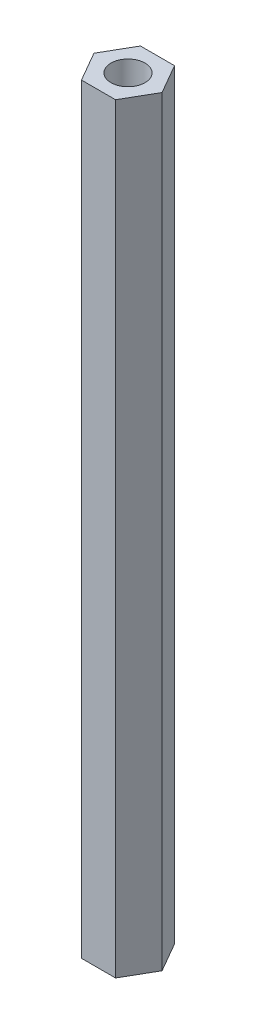
ISO-10303-21;
HEADER;
FILE_DESCRIPTION(('STEP AP214'),'2;1');
FILE_NAME('part.step','',(''),(''),'','','');
FILE_SCHEMA(('AUTOMOTIVE_DESIGN { 1 0 10303 214 1 1 1 1 }'));
ENDSEC;
DATA;
#1=APPLICATION_CONTEXT('core data for automotive mechanical design processes');
#2=APPLICATION_PROTOCOL_DEFINITION('international standard','automotive_design',2000,#1);
#3=PRODUCT_CONTEXT('',#1,'mechanical');
#4=PRODUCT('Part','Part','',(#3));
#5=PRODUCT_RELATED_PRODUCT_CATEGORY('part','',(#4));
#6=PRODUCT_DEFINITION_FORMATION('','',#4);
#7=PRODUCT_DEFINITION_CONTEXT('part definition',#1,'design');
#8=PRODUCT_DEFINITION('design','',#6,#7);
#9=PRODUCT_DEFINITION_SHAPE('','',#8);
#10=(LENGTH_UNIT() NAMED_UNIT(*) SI_UNIT(.MILLI.,.METRE.));
#11=(NAMED_UNIT(*) PLANE_ANGLE_UNIT() SI_UNIT($,.RADIAN.));
#12=(NAMED_UNIT(*) SI_UNIT($,.STERADIAN.) SOLID_ANGLE_UNIT());
#13=UNCERTAINTY_MEASURE_WITH_UNIT(LENGTH_MEASURE(1.E-05),#10,'distance_accuracy_value','');
#14=(GEOMETRIC_REPRESENTATION_CONTEXT(3) GLOBAL_UNCERTAINTY_ASSIGNED_CONTEXT((#13)) GLOBAL_UNIT_ASSIGNED_CONTEXT((#10,
#11,#12)) REPRESENTATION_CONTEXT('',''));
#15=CARTESIAN_POINT('',(0.,0.,0.));
#16=DIRECTION('',(0.,0.,1.));
#17=DIRECTION('',(1.,0.,0.));
#18=AXIS2_PLACEMENT_3D('',#15,#16,#17);
#19=CARTESIAN_POINT('',(0.,67.,0.));
#20=DIRECTION('',(0.,1.,0.));
#21=DIRECTION('',(0.,0.,1.));
#22=AXIS2_PLACEMENT_3D('',#19,#20,#21);
#23=PLANE('',#22);
#24=DIRECTION('',(0.499999999999999,0.,-0.866025403784439));
#25=VECTOR('',#24,1.);
#26=CARTESIAN_POINT('',(1.5,67.,2.59807621135332));
#27=LINE('',#26,#25);
#28=CARTESIAN_POINT('',(1.5,67.,2.59807621135332));
#29=VERTEX_POINT('',#28);
#30=CARTESIAN_POINT('',(3.,67.,0.));
#31=VERTEX_POINT('',#30);
#32=EDGE_CURVE('E150',#29,#31,#27,.T.);
#33=ORIENTED_EDGE('',*,*,#32,.T.);
#34=DIRECTION('',(-0.5,0.,-0.866025403784439));
#35=VECTOR('',#34,1.);
#36=CARTESIAN_POINT('',(3.,67.,0.));
#37=LINE('',#36,#35);
#38=CARTESIAN_POINT('',(1.5,67.,-2.59807621135332));
#39=VERTEX_POINT('',#38);
#40=EDGE_CURVE('E98',#31,#39,#37,.T.);
#41=ORIENTED_EDGE('',*,*,#40,.T.);
#42=DIRECTION('',(-1.,0.,0.));
#43=VECTOR('',#42,1.);
#44=CARTESIAN_POINT('',(1.5,67.,-2.59807621135332));
#45=LINE('',#44,#43);
#46=CARTESIAN_POINT('',(-1.5,67.,-2.59807621135332));
#47=VERTEX_POINT('',#46);
#48=EDGE_CURVE('E111',#39,#47,#45,.T.);
#49=ORIENTED_EDGE('',*,*,#48,.T.);
#50=DIRECTION('',(-0.499999999999999,0.,0.866025403784439));
#51=VECTOR('',#50,1.);
#52=CARTESIAN_POINT('',(-1.5,67.,-2.59807621135332));
#53=LINE('',#52,#51);
#54=CARTESIAN_POINT('',(-3.,67.,0.));
#55=VERTEX_POINT('',#54);
#56=EDGE_CURVE('E105',#47,#55,#53,.T.);
#57=ORIENTED_EDGE('',*,*,#56,.T.);
#58=DIRECTION('',(0.5,0.,0.866025403784439));
#59=VECTOR('',#58,1.);
#60=CARTESIAN_POINT('',(-3.,67.,0.));
#61=LINE('',#60,#59);
#62=CARTESIAN_POINT('',(-1.5,67.,2.59807621135332));
#63=VERTEX_POINT('',#62);
#64=EDGE_CURVE('E109',#55,#63,#61,.T.);
#65=ORIENTED_EDGE('',*,*,#64,.T.);
#66=DIRECTION('',(1.,0.,0.));
#67=VECTOR('',#66,1.);
#68=CARTESIAN_POINT('',(-1.5,67.,2.59807621135332));
#69=LINE('',#68,#67);
#70=EDGE_CURVE('E61',#63,#29,#69,.T.);
#71=ORIENTED_EDGE('',*,*,#70,.T.);
#72=EDGE_LOOP('',(#33,#41,#49,#57,#65,#71));
#73=FACE_BOUND('',#72,.T.);
#74=CARTESIAN_POINT('',(0.,67.,0.));
#75=DIRECTION('',(0.,1.,0.));
#76=DIRECTION('',(0.,0.,1.));
#77=AXIS2_PLACEMENT_3D('',#74,#75,#76);
#78=CIRCLE('',#77,1.5);
#79=CARTESIAN_POINT('',(0.,67.,1.5));
#80=VERTEX_POINT('',#79);
#81=EDGE_CURVE('E138',#80,#80,#78,.T.);
#82=ORIENTED_EDGE('',*,*,#81,.F.);
#83=EDGE_LOOP('',(#82));
#84=FACE_BOUND('',#83,.T.);
#85=ADVANCED_FACE('F43',(#73,#84),#23,.T.);
#86=CARTESIAN_POINT('',(0.,0.,0.));
#87=DIRECTION('',(0.,1.,0.));
#88=DIRECTION('',(0.,0.,1.));
#89=AXIS2_PLACEMENT_3D('',#86,#87,#88);
#90=PLANE('',#89);
#91=DIRECTION('',(0.499999999999999,0.,-0.866025403784439));
#92=VECTOR('',#91,1.);
#93=CARTESIAN_POINT('',(1.5,0.,2.59807621135332));
#94=LINE('',#93,#92);
#95=CARTESIAN_POINT('',(1.5,0.,2.59807621135332));
#96=VERTEX_POINT('',#95);
#97=CARTESIAN_POINT('',(3.,0.,0.));
#98=VERTEX_POINT('',#97);
#99=EDGE_CURVE('E133',#96,#98,#94,.T.);
#100=ORIENTED_EDGE('',*,*,#99,.F.);
#101=DIRECTION('',(1.,0.,0.));
#102=VECTOR('',#101,1.);
#103=CARTESIAN_POINT('',(-1.5,0.,2.59807621135332));
#104=LINE('',#103,#102);
#105=CARTESIAN_POINT('',(-1.5,0.,2.59807621135332));
#106=VERTEX_POINT('',#105);
#107=EDGE_CURVE('E90',#106,#96,#104,.T.);
#108=ORIENTED_EDGE('',*,*,#107,.F.);
#109=DIRECTION('',(0.5,0.,0.866025403784439));
#110=VECTOR('',#109,1.);
#111=CARTESIAN_POINT('',(-3.,0.,0.));
#112=LINE('',#111,#110);
#113=CARTESIAN_POINT('',(-3.,0.,0.));
#114=VERTEX_POINT('',#113);
#115=EDGE_CURVE('E84',#114,#106,#112,.T.);
#116=ORIENTED_EDGE('',*,*,#115,.F.);
#117=DIRECTION('',(-0.499999999999999,0.,0.866025403784439));
#118=VECTOR('',#117,1.);
#119=CARTESIAN_POINT('',(-1.5,0.,-2.59807621135332));
#120=LINE('',#119,#118);
#121=CARTESIAN_POINT('',(-1.5,0.,-2.59807621135332));
#122=VERTEX_POINT('',#121);
#123=EDGE_CURVE('E120',#122,#114,#120,.T.);
#124=ORIENTED_EDGE('',*,*,#123,.F.);
#125=DIRECTION('',(-1.,0.,0.));
#126=VECTOR('',#125,1.);
#127=CARTESIAN_POINT('',(1.5,0.,-2.59807621135332));
#128=LINE('',#127,#126);
#129=CARTESIAN_POINT('',(1.5,0.,-2.59807621135332));
#130=VERTEX_POINT('',#129);
#131=EDGE_CURVE('E141',#130,#122,#128,.T.);
#132=ORIENTED_EDGE('',*,*,#131,.F.);
#133=DIRECTION('',(-0.5,0.,-0.866025403784439));
#134=VECTOR('',#133,1.);
#135=CARTESIAN_POINT('',(3.,0.,0.));
#136=LINE('',#135,#134);
#137=EDGE_CURVE('E137',#98,#130,#136,.T.);
#138=ORIENTED_EDGE('',*,*,#137,.F.);
#139=EDGE_LOOP('',(#100,#108,#116,#124,#132,#138));
#140=FACE_BOUND('',#139,.T.);
#141=CARTESIAN_POINT('',(0.,0.,0.));
#142=DIRECTION('',(0.,1.,0.));
#143=DIRECTION('',(0.,0.,1.));
#144=AXIS2_PLACEMENT_3D('',#141,#142,#143);
#145=CIRCLE('',#144,1.5);
#146=CARTESIAN_POINT('',(0.,0.,1.5));
#147=VERTEX_POINT('',#146);
#148=EDGE_CURVE('E265',#147,#147,#145,.T.);
#149=ORIENTED_EDGE('',*,*,#148,.T.);
#150=EDGE_LOOP('',(#149));
#151=FACE_BOUND('',#150,.T.);
#152=ADVANCED_FACE('F163',(#140,#151),#90,.F.);
#153=CARTESIAN_POINT('',(1.5,67.,2.59807621135332));
#154=DIRECTION('',(-0.866025403784439,0.,-0.499999999999999));
#155=DIRECTION('',(-0.5,0.,0.866025403784439));
#156=AXIS2_PLACEMENT_3D('',#153,#154,#155);
#157=PLANE('',#156);
#158=ORIENTED_EDGE('',*,*,#99,.T.);
#159=DIRECTION('',(0.,-1.,0.));
#160=VECTOR('',#159,1.);
#161=CARTESIAN_POINT('',(3.,67.,0.));
#162=LINE('',#161,#160);
#163=EDGE_CURVE('E11',#31,#98,#162,.T.);
#164=ORIENTED_EDGE('',*,*,#163,.F.);
#165=ORIENTED_EDGE('',*,*,#32,.F.);
#166=DIRECTION('',(0.,-1.,0.));
#167=VECTOR('',#166,1.);
#168=CARTESIAN_POINT('',(1.5,67.,2.59807621135332));
#169=LINE('',#168,#167);
#170=EDGE_CURVE('E129',#29,#96,#169,.T.);
#171=ORIENTED_EDGE('',*,*,#170,.T.);
#172=EDGE_LOOP('',(#158,#164,#165,#171));
#173=FACE_BOUND('',#172,.T.);
#174=ADVANCED_FACE('F45',(#173),#157,.F.);
#175=CARTESIAN_POINT('',(3.,67.,0.));
#176=DIRECTION('',(-0.866025403784439,0.,0.5));
#177=DIRECTION('',(0.5,0.,0.866025403784439));
#178=AXIS2_PLACEMENT_3D('',#175,#176,#177);
#179=PLANE('',#178);
#180=ORIENTED_EDGE('',*,*,#137,.T.);
#181=DIRECTION('',(0.,-1.,0.));
#182=VECTOR('',#181,1.);
#183=CARTESIAN_POINT('',(1.5,67.,-2.59807621135332));
#184=LINE('',#183,#182);
#185=EDGE_CURVE('E53',#39,#130,#184,.T.);
#186=ORIENTED_EDGE('',*,*,#185,.F.);
#187=ORIENTED_EDGE('',*,*,#40,.F.);
#188=ORIENTED_EDGE('',*,*,#163,.T.);
#189=EDGE_LOOP('',(#180,#186,#187,#188));
#190=FACE_BOUND('',#189,.T.);
#191=ADVANCED_FACE('F188',(#190),#179,.F.);
#192=CARTESIAN_POINT('',(1.5,67.,-2.59807621135332));
#193=DIRECTION('',(0.,0.,1.));
#194=DIRECTION('',(1.,0.,0.));
#195=AXIS2_PLACEMENT_3D('',#192,#193,#194);
#196=PLANE('',#195);
#197=ORIENTED_EDGE('',*,*,#131,.T.);
#198=DIRECTION('',(0.,-1.,0.));
#199=VECTOR('',#198,1.);
#200=CARTESIAN_POINT('',(-1.5,67.,-2.59807621135332));
#201=LINE('',#200,#199);
#202=EDGE_CURVE('E122',#47,#122,#201,.T.);
#203=ORIENTED_EDGE('',*,*,#202,.F.);
#204=ORIENTED_EDGE('',*,*,#48,.F.);
#205=ORIENTED_EDGE('',*,*,#185,.T.);
#206=EDGE_LOOP('',(#197,#203,#204,#205));
#207=FACE_BOUND('',#206,.T.);
#208=ADVANCED_FACE('F160',(#207),#196,.F.);
#209=CARTESIAN_POINT('',(-1.5,67.,-2.59807621135332));
#210=DIRECTION('',(0.866025403784439,0.,0.499999999999999));
#211=DIRECTION('',(0.499999999999999,0.,-0.866025403784439));
#212=AXIS2_PLACEMENT_3D('',#209,#210,#211);
#213=PLANE('',#212);
#214=ORIENTED_EDGE('',*,*,#123,.T.);
#215=DIRECTION('',(0.,-1.,0.));
#216=VECTOR('',#215,1.);
#217=CARTESIAN_POINT('',(-3.,67.,0.));
#218=LINE('',#217,#216);
#219=EDGE_CURVE('E117',#55,#114,#218,.T.);
#220=ORIENTED_EDGE('',*,*,#219,.F.);
#221=ORIENTED_EDGE('',*,*,#56,.F.);
#222=ORIENTED_EDGE('',*,*,#202,.T.);
#223=EDGE_LOOP('',(#214,#220,#221,#222));
#224=FACE_BOUND('',#223,.T.);
#225=ADVANCED_FACE('F118',(#224),#213,.F.);
#226=CARTESIAN_POINT('',(-3.,67.,0.));
#227=DIRECTION('',(0.866025403784439,0.,-0.5));
#228=DIRECTION('',(-0.5,0.,-0.866025403784439));
#229=AXIS2_PLACEMENT_3D('',#226,#227,#228);
#230=PLANE('',#229);
#231=ORIENTED_EDGE('',*,*,#115,.T.);
#232=DIRECTION('',(0.,-1.,0.));
#233=VECTOR('',#232,1.);
#234=CARTESIAN_POINT('',(-1.5,67.,2.59807621135332));
#235=LINE('',#234,#233);
#236=EDGE_CURVE('E123',#63,#106,#235,.T.);
#237=ORIENTED_EDGE('',*,*,#236,.F.);
#238=ORIENTED_EDGE('',*,*,#64,.F.);
#239=ORIENTED_EDGE('',*,*,#219,.T.);
#240=EDGE_LOOP('',(#231,#237,#238,#239));
#241=FACE_BOUND('',#240,.T.);
#242=ADVANCED_FACE('F125',(#241),#230,.F.);
#243=CARTESIAN_POINT('',(-1.5,67.,2.59807621135332));
#244=DIRECTION('',(0.,0.,-1.));
#245=DIRECTION('',(-1.,0.,0.));
#246=AXIS2_PLACEMENT_3D('',#243,#244,#245);
#247=PLANE('',#246);
#248=ORIENTED_EDGE('',*,*,#107,.T.);
#249=ORIENTED_EDGE('',*,*,#170,.F.);
#250=ORIENTED_EDGE('',*,*,#70,.F.);
#251=ORIENTED_EDGE('',*,*,#236,.T.);
#252=EDGE_LOOP('',(#248,#249,#250,#251));
#253=FACE_BOUND('',#252,.T.);
#254=ADVANCED_FACE('F168',(#253),#247,.F.);
#255=CARTESIAN_POINT('',(0.,67.,0.));
#256=DIRECTION('',(0.,-1.,0.));
#257=DIRECTION('',(0.,0.,-1.));
#258=AXIS2_PLACEMENT_3D('',#255,#256,#257);
#259=CYLINDRICAL_SURFACE('',#258,1.5);
#260=ORIENTED_EDGE('',*,*,#81,.T.);
#261=EDGE_LOOP('',(#260));
#262=FACE_BOUND('',#261,.T.);
#263=ORIENTED_EDGE('',*,*,#148,.F.);
#264=EDGE_LOOP('',(#263));
#265=FACE_BOUND('',#264,.T.);
#266=ADVANCED_FACE('F170',(#262,#265),#259,.F.);
#267=CLOSED_SHELL('',(#85,#152,#174,#191,#208,#225,#242,#254,#266));
#268=MANIFOLD_SOLID_BREP('B2',#267);
#269=ADVANCED_BREP_SHAPE_REPRESENTATION('',(#18,#268),#14);
#270=SHAPE_DEFINITION_REPRESENTATION(#9,#269);
ENDSEC;
END-ISO-10303-21;
